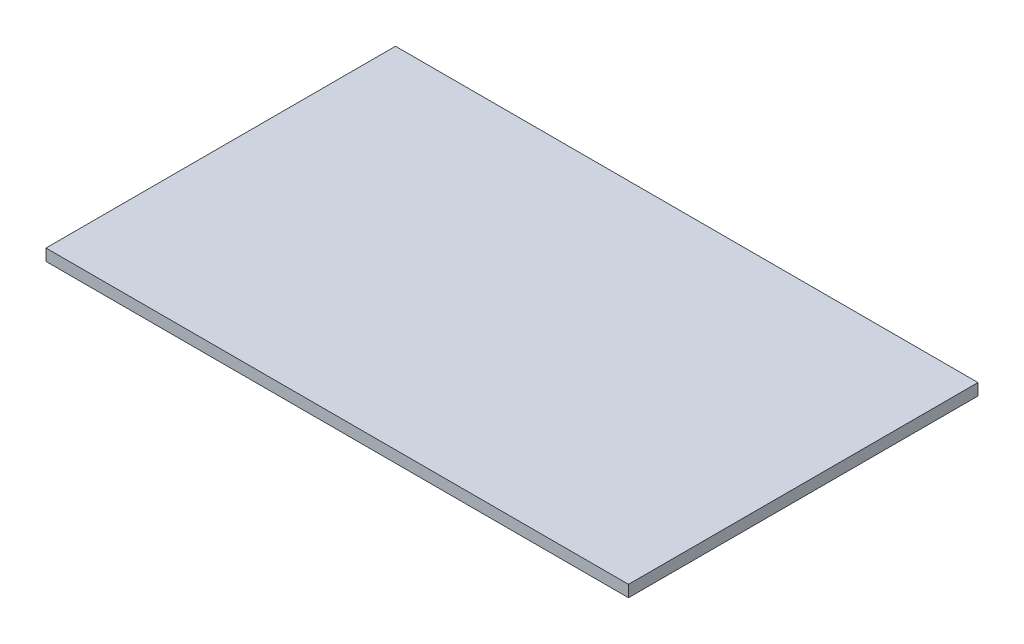
ISO-10303-21;
HEADER;
FILE_DESCRIPTION(('STEP AP214'),'2;1');
FILE_NAME('part.step','',(''),(''),'','','');
FILE_SCHEMA(('AUTOMOTIVE_DESIGN { 1 0 10303 214 1 1 1 1 }'));
ENDSEC;
DATA;
#1=APPLICATION_CONTEXT('core data for automotive mechanical design processes');
#2=APPLICATION_PROTOCOL_DEFINITION('international standard','automotive_design',2000,#1);
#3=PRODUCT_CONTEXT('',#1,'mechanical');
#4=PRODUCT('Part','Part','',(#3));
#5=PRODUCT_RELATED_PRODUCT_CATEGORY('part','',(#4));
#6=PRODUCT_DEFINITION_FORMATION('','',#4);
#7=PRODUCT_DEFINITION_CONTEXT('part definition',#1,'design');
#8=PRODUCT_DEFINITION('design','',#6,#7);
#9=PRODUCT_DEFINITION_SHAPE('','',#8);
#10=(LENGTH_UNIT() NAMED_UNIT(*) SI_UNIT(.MILLI.,.METRE.));
#11=(NAMED_UNIT(*) PLANE_ANGLE_UNIT() SI_UNIT($,.RADIAN.));
#12=(NAMED_UNIT(*) SI_UNIT($,.STERADIAN.) SOLID_ANGLE_UNIT());
#13=UNCERTAINTY_MEASURE_WITH_UNIT(LENGTH_MEASURE(1.E-05),#10,'distance_accuracy_value','');
#14=(GEOMETRIC_REPRESENTATION_CONTEXT(3) GLOBAL_UNCERTAINTY_ASSIGNED_CONTEXT((#13)) GLOBAL_UNIT_ASSIGNED_CONTEXT((#10,
#11,#12)) REPRESENTATION_CONTEXT('',''));
#15=CARTESIAN_POINT('',(0.,0.,0.));
#16=DIRECTION('',(0.,0.,1.));
#17=DIRECTION('',(1.,0.,0.));
#18=AXIS2_PLACEMENT_3D('',#15,#16,#17);
#19=CARTESIAN_POINT('',(0.,100.,0.));
#20=DIRECTION('',(1.,0.,0.));
#21=DIRECTION('',(0.,0.,-1.));
#22=AXIS2_PLACEMENT_3D('',#19,#20,#21);
#23=PLANE('',#22);
#24=DIRECTION('',(0.,0.,1.));
#25=VECTOR('',#24,1.);
#26=CARTESIAN_POINT('',(0.,0.,0.));
#27=LINE('',#26,#25);
#28=CARTESIAN_POINT('',(0.,0.,-3000.));
#29=VERTEX_POINT('',#28);
#30=CARTESIAN_POINT('',(0.,0.,0.));
#31=VERTEX_POINT('',#30);
#32=EDGE_CURVE('E75',#29,#31,#27,.T.);
#33=ORIENTED_EDGE('',*,*,#32,.T.);
#34=DIRECTION('',(0.,-1.,0.));
#35=VECTOR('',#34,1.);
#36=CARTESIAN_POINT('',(0.,100.,0.));
#37=LINE('',#36,#35);
#38=CARTESIAN_POINT('',(0.,100.,0.));
#39=VERTEX_POINT('',#38);
#40=EDGE_CURVE('E11',#39,#31,#37,.T.);
#41=ORIENTED_EDGE('',*,*,#40,.F.);
#42=DIRECTION('',(0.,0.,1.));
#43=VECTOR('',#42,1.);
#44=CARTESIAN_POINT('',(0.,100.,0.));
#45=LINE('',#44,#43);
#46=CARTESIAN_POINT('',(0.,100.,-3000.));
#47=VERTEX_POINT('',#46);
#48=EDGE_CURVE('E93',#47,#39,#45,.T.);
#49=ORIENTED_EDGE('',*,*,#48,.F.);
#50=DIRECTION('',(0.,-1.,0.));
#51=VECTOR('',#50,1.);
#52=CARTESIAN_POINT('',(0.,100.,-3000.));
#53=LINE('',#52,#51);
#54=EDGE_CURVE('E87',#47,#29,#53,.T.);
#55=ORIENTED_EDGE('',*,*,#54,.T.);
#56=EDGE_LOOP('',(#33,#41,#49,#55));
#57=FACE_BOUND('',#56,.T.);
#58=ADVANCED_FACE('F31',(#57),#23,.F.);
#59=CARTESIAN_POINT('',(0.,100.,0.));
#60=DIRECTION('',(0.,0.,-1.));
#61=DIRECTION('',(-1.,0.,0.));
#62=AXIS2_PLACEMENT_3D('',#59,#60,#61);
#63=PLANE('',#62);
#64=DIRECTION('',(1.,0.,0.));
#65=VECTOR('',#64,1.);
#66=CARTESIAN_POINT('',(0.,0.,0.));
#67=LINE('',#66,#65);
#68=CARTESIAN_POINT('',(5000.,0.,0.));
#69=VERTEX_POINT('',#68);
#70=EDGE_CURVE('E71',#31,#69,#67,.T.);
#71=ORIENTED_EDGE('',*,*,#70,.T.);
#72=DIRECTION('',(0.,-1.,0.));
#73=VECTOR('',#72,1.);
#74=CARTESIAN_POINT('',(5000.,100.,0.));
#75=LINE('',#74,#73);
#76=CARTESIAN_POINT('',(5000.,100.,0.));
#77=VERTEX_POINT('',#76);
#78=EDGE_CURVE('E38',#77,#69,#75,.T.);
#79=ORIENTED_EDGE('',*,*,#78,.F.);
#80=DIRECTION('',(1.,0.,0.));
#81=VECTOR('',#80,1.);
#82=CARTESIAN_POINT('',(0.,100.,0.));
#83=LINE('',#82,#81);
#84=EDGE_CURVE('E83',#39,#77,#83,.T.);
#85=ORIENTED_EDGE('',*,*,#84,.F.);
#86=ORIENTED_EDGE('',*,*,#40,.T.);
#87=EDGE_LOOP('',(#71,#79,#85,#86));
#88=FACE_BOUND('',#87,.T.);
#89=ADVANCED_FACE('F82',(#88),#63,.F.);
#90=CARTESIAN_POINT('',(5000.,100.,0.));
#91=DIRECTION('',(-1.,0.,0.));
#92=DIRECTION('',(0.,0.,1.));
#93=AXIS2_PLACEMENT_3D('',#90,#91,#92);
#94=PLANE('',#93);
#95=DIRECTION('',(0.,0.,-1.));
#96=VECTOR('',#95,1.);
#97=CARTESIAN_POINT('',(5000.,0.,0.));
#98=LINE('',#97,#96);
#99=CARTESIAN_POINT('',(5000.,0.,-3000.));
#100=VERTEX_POINT('',#99);
#101=EDGE_CURVE('E76',#69,#100,#98,.T.);
#102=ORIENTED_EDGE('',*,*,#101,.T.);
#103=DIRECTION('',(0.,-1.,0.));
#104=VECTOR('',#103,1.);
#105=CARTESIAN_POINT('',(5000.,100.,-3000.));
#106=LINE('',#105,#104);
#107=CARTESIAN_POINT('',(5000.,100.,-3000.));
#108=VERTEX_POINT('',#107);
#109=EDGE_CURVE('E99',#108,#100,#106,.T.);
#110=ORIENTED_EDGE('',*,*,#109,.F.);
#111=DIRECTION('',(0.,0.,-1.));
#112=VECTOR('',#111,1.);
#113=CARTESIAN_POINT('',(5000.,100.,0.));
#114=LINE('',#113,#112);
#115=EDGE_CURVE('E50',#77,#108,#114,.T.);
#116=ORIENTED_EDGE('',*,*,#115,.F.);
#117=ORIENTED_EDGE('',*,*,#78,.T.);
#118=EDGE_LOOP('',(#102,#110,#116,#117));
#119=FACE_BOUND('',#118,.T.);
#120=ADVANCED_FACE('F102',(#119),#94,.F.);
#121=CARTESIAN_POINT('',(0.,100.,-3000.));
#122=DIRECTION('',(0.,0.,1.));
#123=DIRECTION('',(1.,0.,0.));
#124=AXIS2_PLACEMENT_3D('',#121,#122,#123);
#125=PLANE('',#124);
#126=DIRECTION('',(-1.,0.,0.));
#127=VECTOR('',#126,1.);
#128=CARTESIAN_POINT('',(0.,0.,-3000.));
#129=LINE('',#128,#127);
#130=EDGE_CURVE('E91',#100,#29,#129,.T.);
#131=ORIENTED_EDGE('',*,*,#130,.T.);
#132=ORIENTED_EDGE('',*,*,#54,.F.);
#133=DIRECTION('',(-1.,0.,0.));
#134=VECTOR('',#133,1.);
#135=CARTESIAN_POINT('',(0.,100.,-3000.));
#136=LINE('',#135,#134);
#137=EDGE_CURVE('E45',#108,#47,#136,.T.);
#138=ORIENTED_EDGE('',*,*,#137,.F.);
#139=ORIENTED_EDGE('',*,*,#109,.T.);
#140=EDGE_LOOP('',(#131,#132,#138,#139));
#141=FACE_BOUND('',#140,.T.);
#142=ADVANCED_FACE('F104',(#141),#125,.F.);
#143=CARTESIAN_POINT('',(0.,100.,-3000.));
#144=DIRECTION('',(0.,-1.,0.));
#145=DIRECTION('',(0.,0.,-1.));
#146=AXIS2_PLACEMENT_3D('',#143,#144,#145);
#147=PLANE('',#146);
#148=ORIENTED_EDGE('',*,*,#48,.T.);
#149=ORIENTED_EDGE('',*,*,#84,.T.);
#150=ORIENTED_EDGE('',*,*,#115,.T.);
#151=ORIENTED_EDGE('',*,*,#137,.T.);
#152=EDGE_LOOP('',(#148,#149,#150,#151));
#153=FACE_BOUND('',#152,.T.);
#154=ADVANCED_FACE('F105',(#153),#147,.F.);
#155=CARTESIAN_POINT('',(0.,0.,-3000.));
#156=DIRECTION('',(0.,-1.,0.));
#157=DIRECTION('',(0.,0.,-1.));
#158=AXIS2_PLACEMENT_3D('',#155,#156,#157);
#159=PLANE('',#158);
#160=ORIENTED_EDGE('',*,*,#32,.F.);
#161=ORIENTED_EDGE('',*,*,#130,.F.);
#162=ORIENTED_EDGE('',*,*,#101,.F.);
#163=ORIENTED_EDGE('',*,*,#70,.F.);
#164=EDGE_LOOP('',(#160,#161,#162,#163));
#165=FACE_BOUND('',#164,.T.);
#166=ADVANCED_FACE('F72',(#165),#159,.T.);
#167=CLOSED_SHELL('',(#58,#89,#120,#142,#154,#166));
#168=MANIFOLD_SOLID_BREP('B2',#167);
#169=ADVANCED_BREP_SHAPE_REPRESENTATION('',(#18,#168),#14);
#170=SHAPE_DEFINITION_REPRESENTATION(#9,#169);
ENDSEC;
END-ISO-10303-21;
